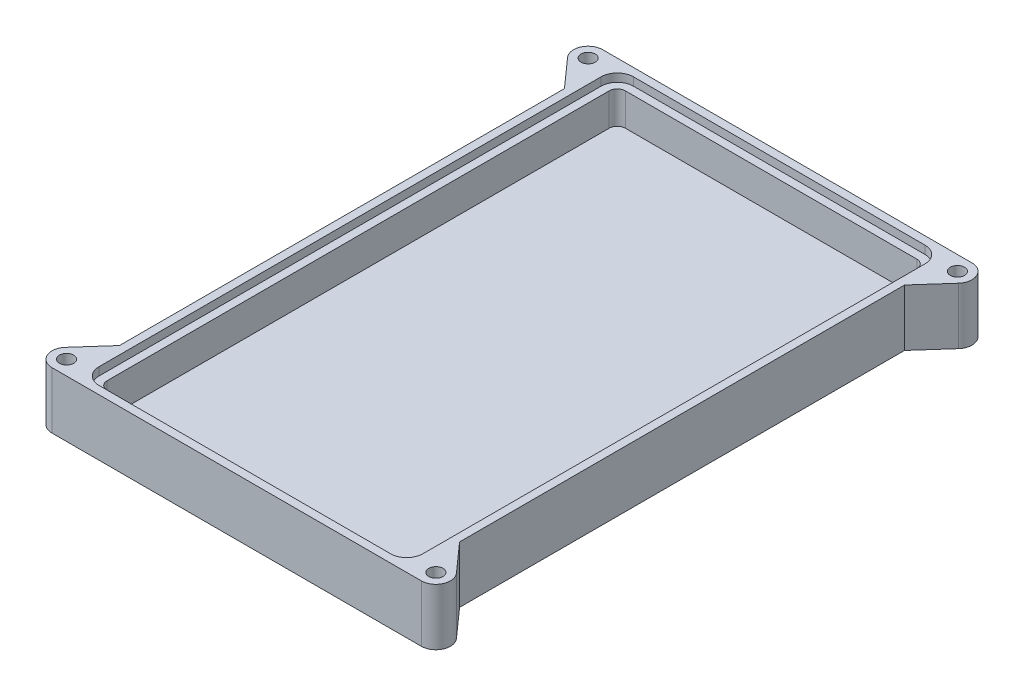
ISO-10303-21;
HEADER;
FILE_DESCRIPTION(('STEP AP214'),'2;1');
FILE_NAME('part.step','',(''),(''),'','','');
FILE_SCHEMA(('AUTOMOTIVE_DESIGN { 1 0 10303 214 1 1 1 1 }'));
ENDSEC;
DATA;
#1=APPLICATION_CONTEXT('core data for automotive mechanical design processes');
#2=APPLICATION_PROTOCOL_DEFINITION('international standard','automotive_design',2000,#1);
#3=PRODUCT_CONTEXT('',#1,'mechanical');
#4=PRODUCT('Part','Part','',(#3));
#5=PRODUCT_RELATED_PRODUCT_CATEGORY('part','',(#4));
#6=PRODUCT_DEFINITION_FORMATION('','',#4);
#7=PRODUCT_DEFINITION_CONTEXT('part definition',#1,'design');
#8=PRODUCT_DEFINITION('design','',#6,#7);
#9=PRODUCT_DEFINITION_SHAPE('','',#8);
#10=(LENGTH_UNIT() NAMED_UNIT(*) SI_UNIT(.MILLI.,.METRE.));
#11=(NAMED_UNIT(*) PLANE_ANGLE_UNIT() SI_UNIT($,.RADIAN.));
#12=(NAMED_UNIT(*) SI_UNIT($,.STERADIAN.) SOLID_ANGLE_UNIT());
#13=UNCERTAINTY_MEASURE_WITH_UNIT(LENGTH_MEASURE(1.E-05),#10,'distance_accuracy_value','');
#14=(GEOMETRIC_REPRESENTATION_CONTEXT(3) GLOBAL_UNCERTAINTY_ASSIGNED_CONTEXT((#13)) GLOBAL_UNIT_ASSIGNED_CONTEXT((#10,
#11,#12)) REPRESENTATION_CONTEXT('',''));
#15=CARTESIAN_POINT('',(0.,0.,0.));
#16=DIRECTION('',(0.,0.,1.));
#17=DIRECTION('',(1.,0.,0.));
#18=AXIS2_PLACEMENT_3D('',#15,#16,#17);
#19=CARTESIAN_POINT('',(45.,21.,-77.5));
#20=DIRECTION('',(0.,1.,0.));
#21=DIRECTION('',(0.,0.,1.));
#22=AXIS2_PLACEMENT_3D('',#19,#20,#21);
#23=CYLINDRICAL_SURFACE('',#22,5.);
#24=CARTESIAN_POINT('',(45.,23.5,-77.5));
#25=DIRECTION('',(0.,1.,0.));
#26=DIRECTION('',(0.,0.,1.));
#27=AXIS2_PLACEMENT_3D('',#24,#25,#26);
#28=CIRCLE('',#27,5.);
#29=CARTESIAN_POINT('',(45.,23.5,-82.5));
#30=VERTEX_POINT('',#29);
#31=CARTESIAN_POINT('',(50.,23.5,-77.5));
#32=VERTEX_POINT('',#31);
#33=EDGE_CURVE('E494',#30,#32,#28,.F.);
#34=ORIENTED_EDGE('',*,*,#33,.F.);
#35=DIRECTION('',(0.,1.,0.));
#36=VECTOR('',#35,1.);
#37=CARTESIAN_POINT('',(45.,21.,-82.5));
#38=LINE('',#37,#36);
#39=CARTESIAN_POINT('',(45.,21.,-82.5));
#40=VERTEX_POINT('',#39);
#41=EDGE_CURVE('E402',#40,#30,#38,.T.);
#42=ORIENTED_EDGE('',*,*,#41,.F.);
#43=CARTESIAN_POINT('',(45.,21.,-77.5));
#44=DIRECTION('',(0.,1.,0.));
#45=DIRECTION('',(0.,0.,1.));
#46=AXIS2_PLACEMENT_3D('',#43,#44,#45);
#47=CIRCLE('',#46,5.);
#48=CARTESIAN_POINT('',(50.,21.,-77.5));
#49=VERTEX_POINT('',#48);
#50=EDGE_CURVE('E378',#49,#40,#47,.T.);
#51=ORIENTED_EDGE('',*,*,#50,.F.);
#52=DIRECTION('',(0.,1.,0.));
#53=VECTOR('',#52,1.);
#54=CARTESIAN_POINT('',(50.,21.,-77.5));
#55=LINE('',#54,#53);
#56=EDGE_CURVE('E403',#49,#32,#55,.T.);
#57=ORIENTED_EDGE('',*,*,#56,.T.);
#58=EDGE_LOOP('',(#34,#42,#51,#57));
#59=FACE_BOUND('',#58,.T.);
#60=ADVANCED_FACE('F34',(#59),#23,.F.);
#61=CARTESIAN_POINT('',(50.,21.,77.5));
#62=DIRECTION('',(1.,0.,0.));
#63=DIRECTION('',(0.,0.,-1.));
#64=AXIS2_PLACEMENT_3D('',#61,#62,#63);
#65=PLANE('',#64);
#66=DIRECTION('',(0.,0.,1.));
#67=VECTOR('',#66,1.);
#68=CARTESIAN_POINT('',(50.,23.5,77.5));
#69=LINE('',#68,#67);
#70=CARTESIAN_POINT('',(50.,23.5,77.5));
#71=VERTEX_POINT('',#70);
#72=EDGE_CURVE('E492',#32,#71,#69,.T.);
#73=ORIENTED_EDGE('',*,*,#72,.F.);
#74=ORIENTED_EDGE('',*,*,#56,.F.);
#75=DIRECTION('',(0.,0.,-1.));
#76=VECTOR('',#75,1.);
#77=CARTESIAN_POINT('',(50.,21.,77.5));
#78=LINE('',#77,#76);
#79=CARTESIAN_POINT('',(50.,21.,77.5));
#80=VERTEX_POINT('',#79);
#81=EDGE_CURVE('E399',#80,#49,#78,.T.);
#82=ORIENTED_EDGE('',*,*,#81,.F.);
#83=DIRECTION('',(0.,1.,0.));
#84=VECTOR('',#83,1.);
#85=CARTESIAN_POINT('',(50.,21.,77.5));
#86=LINE('',#85,#84);
#87=EDGE_CURVE('E406',#80,#71,#86,.T.);
#88=ORIENTED_EDGE('',*,*,#87,.T.);
#89=EDGE_LOOP('',(#73,#74,#82,#88));
#90=FACE_BOUND('',#89,.T.);
#91=ADVANCED_FACE('F515',(#90),#65,.F.);
#92=CARTESIAN_POINT('',(45.,21.,77.5));
#93=DIRECTION('',(0.,1.,0.));
#94=DIRECTION('',(0.,0.,1.));
#95=AXIS2_PLACEMENT_3D('',#92,#93,#94);
#96=CYLINDRICAL_SURFACE('',#95,5.);
#97=CARTESIAN_POINT('',(45.,23.5,77.5));
#98=DIRECTION('',(0.,1.,0.));
#99=DIRECTION('',(0.,0.,1.));
#100=AXIS2_PLACEMENT_3D('',#97,#98,#99);
#101=CIRCLE('',#100,5.);
#102=CARTESIAN_POINT('',(45.,23.5,82.5));
#103=VERTEX_POINT('',#102);
#104=EDGE_CURVE('E490',#71,#103,#101,.F.);
#105=ORIENTED_EDGE('',*,*,#104,.F.);
#106=ORIENTED_EDGE('',*,*,#87,.F.);
#107=CARTESIAN_POINT('',(45.,21.,77.5));
#108=DIRECTION('',(0.,1.,0.));
#109=DIRECTION('',(0.,0.,1.));
#110=AXIS2_PLACEMENT_3D('',#107,#108,#109);
#111=CIRCLE('',#110,5.);
#112=CARTESIAN_POINT('',(45.,21.,82.5));
#113=VERTEX_POINT('',#112);
#114=EDGE_CURVE('E396',#113,#80,#111,.T.);
#115=ORIENTED_EDGE('',*,*,#114,.F.);
#116=DIRECTION('',(0.,1.,0.));
#117=VECTOR('',#116,1.);
#118=CARTESIAN_POINT('',(45.,21.,82.5));
#119=LINE('',#118,#117);
#120=EDGE_CURVE('E409',#113,#103,#119,.T.);
#121=ORIENTED_EDGE('',*,*,#120,.T.);
#122=EDGE_LOOP('',(#105,#106,#115,#121));
#123=FACE_BOUND('',#122,.T.);
#124=ADVANCED_FACE('F521',(#123),#96,.F.);
#125=CARTESIAN_POINT('',(-45.,21.,82.5));
#126=DIRECTION('',(0.,0.,1.));
#127=DIRECTION('',(1.,0.,0.));
#128=AXIS2_PLACEMENT_3D('',#125,#126,#127);
#129=PLANE('',#128);
#130=DIRECTION('',(-1.,0.,0.));
#131=VECTOR('',#130,1.);
#132=CARTESIAN_POINT('',(-45.,23.5,82.5));
#133=LINE('',#132,#131);
#134=CARTESIAN_POINT('',(-45.,23.5,82.5));
#135=VERTEX_POINT('',#134);
#136=EDGE_CURVE('E488',#103,#135,#133,.T.);
#137=ORIENTED_EDGE('',*,*,#136,.F.);
#138=ORIENTED_EDGE('',*,*,#120,.F.);
#139=DIRECTION('',(1.,0.,0.));
#140=VECTOR('',#139,1.);
#141=CARTESIAN_POINT('',(-45.,21.,82.5));
#142=LINE('',#141,#140);
#143=CARTESIAN_POINT('',(-45.,21.,82.5));
#144=VERTEX_POINT('',#143);
#145=EDGE_CURVE('E393',#144,#113,#142,.T.);
#146=ORIENTED_EDGE('',*,*,#145,.F.);
#147=DIRECTION('',(0.,1.,0.));
#148=VECTOR('',#147,1.);
#149=CARTESIAN_POINT('',(-45.,21.,82.5));
#150=LINE('',#149,#148);
#151=EDGE_CURVE('E412',#144,#135,#150,.T.);
#152=ORIENTED_EDGE('',*,*,#151,.T.);
#153=EDGE_LOOP('',(#137,#138,#146,#152));
#154=FACE_BOUND('',#153,.T.);
#155=ADVANCED_FACE('F553',(#154),#129,.F.);
#156=CARTESIAN_POINT('',(-45.,21.,77.5));
#157=DIRECTION('',(0.,1.,0.));
#158=DIRECTION('',(0.,0.,1.));
#159=AXIS2_PLACEMENT_3D('',#156,#157,#158);
#160=CYLINDRICAL_SURFACE('',#159,5.);
#161=CARTESIAN_POINT('',(-45.,23.5,77.5));
#162=DIRECTION('',(0.,1.,0.));
#163=DIRECTION('',(0.,0.,1.));
#164=AXIS2_PLACEMENT_3D('',#161,#162,#163);
#165=CIRCLE('',#164,5.);
#166=CARTESIAN_POINT('',(-50.,23.5,77.5));
#167=VERTEX_POINT('',#166);
#168=EDGE_CURVE('E486',#135,#167,#165,.F.);
#169=ORIENTED_EDGE('',*,*,#168,.F.);
#170=ORIENTED_EDGE('',*,*,#151,.F.);
#171=CARTESIAN_POINT('',(-45.,21.,77.5));
#172=DIRECTION('',(0.,1.,0.));
#173=DIRECTION('',(0.,0.,1.));
#174=AXIS2_PLACEMENT_3D('',#171,#172,#173);
#175=CIRCLE('',#174,5.);
#176=CARTESIAN_POINT('',(-50.,21.,77.5));
#177=VERTEX_POINT('',#176);
#178=EDGE_CURVE('E390',#177,#144,#175,.T.);
#179=ORIENTED_EDGE('',*,*,#178,.F.);
#180=DIRECTION('',(0.,1.,0.));
#181=VECTOR('',#180,1.);
#182=CARTESIAN_POINT('',(-50.,21.,77.5));
#183=LINE('',#182,#181);
#184=EDGE_CURVE('E415',#177,#167,#183,.T.);
#185=ORIENTED_EDGE('',*,*,#184,.T.);
#186=EDGE_LOOP('',(#169,#170,#179,#185));
#187=FACE_BOUND('',#186,.T.);
#188=ADVANCED_FACE('F557',(#187),#160,.F.);
#189=CARTESIAN_POINT('',(-50.,21.,-77.5));
#190=DIRECTION('',(-1.,0.,0.));
#191=DIRECTION('',(0.,0.,1.));
#192=AXIS2_PLACEMENT_3D('',#189,#190,#191);
#193=PLANE('',#192);
#194=DIRECTION('',(0.,0.,-1.));
#195=VECTOR('',#194,1.);
#196=CARTESIAN_POINT('',(-50.,23.5,-77.5));
#197=LINE('',#196,#195);
#198=CARTESIAN_POINT('',(-50.,23.5,-77.5));
#199=VERTEX_POINT('',#198);
#200=EDGE_CURVE('E484',#167,#199,#197,.T.);
#201=ORIENTED_EDGE('',*,*,#200,.F.);
#202=ORIENTED_EDGE('',*,*,#184,.F.);
#203=DIRECTION('',(0.,0.,1.));
#204=VECTOR('',#203,1.);
#205=CARTESIAN_POINT('',(-50.,21.,-77.5));
#206=LINE('',#205,#204);
#207=CARTESIAN_POINT('',(-50.,21.,-77.5));
#208=VERTEX_POINT('',#207);
#209=EDGE_CURVE('E387',#208,#177,#206,.T.);
#210=ORIENTED_EDGE('',*,*,#209,.F.);
#211=DIRECTION('',(0.,1.,0.));
#212=VECTOR('',#211,1.);
#213=CARTESIAN_POINT('',(-50.,21.,-77.5));
#214=LINE('',#213,#212);
#215=EDGE_CURVE('E418',#208,#199,#214,.T.);
#216=ORIENTED_EDGE('',*,*,#215,.T.);
#217=EDGE_LOOP('',(#201,#202,#210,#216));
#218=FACE_BOUND('',#217,.T.);
#219=ADVANCED_FACE('F561',(#218),#193,.F.);
#220=CARTESIAN_POINT('',(-45.,21.,-77.5));
#221=DIRECTION('',(0.,1.,0.));
#222=DIRECTION('',(0.,0.,1.));
#223=AXIS2_PLACEMENT_3D('',#220,#221,#222);
#224=CYLINDRICAL_SURFACE('',#223,5.);
#225=CARTESIAN_POINT('',(-45.,23.5,-77.5));
#226=DIRECTION('',(0.,1.,0.));
#227=DIRECTION('',(0.,0.,1.));
#228=AXIS2_PLACEMENT_3D('',#225,#226,#227);
#229=CIRCLE('',#228,5.);
#230=CARTESIAN_POINT('',(-45.,23.5,-82.5));
#231=VERTEX_POINT('',#230);
#232=EDGE_CURVE('E56',#199,#231,#229,.F.);
#233=ORIENTED_EDGE('',*,*,#232,.F.);
#234=ORIENTED_EDGE('',*,*,#215,.F.);
#235=CARTESIAN_POINT('',(-45.,21.,-77.5));
#236=DIRECTION('',(0.,1.,0.));
#237=DIRECTION('',(0.,0.,1.));
#238=AXIS2_PLACEMENT_3D('',#235,#236,#237);
#239=CIRCLE('',#238,5.);
#240=CARTESIAN_POINT('',(-45.,21.,-82.5));
#241=VERTEX_POINT('',#240);
#242=EDGE_CURVE('E384',#241,#208,#239,.T.);
#243=ORIENTED_EDGE('',*,*,#242,.F.);
#244=DIRECTION('',(0.,1.,0.));
#245=VECTOR('',#244,1.);
#246=CARTESIAN_POINT('',(-45.,21.,-82.5));
#247=LINE('',#246,#245);
#248=EDGE_CURVE('E421',#241,#231,#247,.T.);
#249=ORIENTED_EDGE('',*,*,#248,.T.);
#250=EDGE_LOOP('',(#233,#234,#243,#249));
#251=FACE_BOUND('',#250,.T.);
#252=ADVANCED_FACE('F564',(#251),#224,.F.);
#253=CARTESIAN_POINT('',(45.,21.,-82.5));
#254=DIRECTION('',(0.,0.,-1.));
#255=DIRECTION('',(-1.,0.,0.));
#256=AXIS2_PLACEMENT_3D('',#253,#254,#255);
#257=PLANE('',#256);
#258=DIRECTION('',(1.,0.,0.));
#259=VECTOR('',#258,1.);
#260=CARTESIAN_POINT('',(45.,23.5,-82.5));
#261=LINE('',#260,#259);
#262=EDGE_CURVE('E11',#231,#30,#261,.T.);
#263=ORIENTED_EDGE('',*,*,#262,.F.);
#264=ORIENTED_EDGE('',*,*,#248,.F.);
#265=DIRECTION('',(-1.,0.,0.));
#266=VECTOR('',#265,1.);
#267=CARTESIAN_POINT('',(45.,21.,-82.5));
#268=LINE('',#267,#266);
#269=EDGE_CURVE('E381',#40,#241,#268,.T.);
#270=ORIENTED_EDGE('',*,*,#269,.F.);
#271=ORIENTED_EDGE('',*,*,#41,.T.);
#272=EDGE_LOOP('',(#263,#264,#270,#271));
#273=FACE_BOUND('',#272,.T.);
#274=ADVANCED_FACE('F526',(#273),#257,.F.);
#275=CARTESIAN_POINT('',(45.,21.,-77.5));
#276=DIRECTION('',(0.,1.,0.));
#277=DIRECTION('',(0.,0.,1.));
#278=AXIS2_PLACEMENT_3D('',#275,#276,#277);
#279=PLANE('',#278);
#280=DIRECTION('',(-1.,0.,0.));
#281=VECTOR('',#280,1.);
#282=CARTESIAN_POINT('',(45.,21.,-80.));
#283=LINE('',#282,#281);
#284=CARTESIAN_POINT('',(45.,21.,-80.));
#285=VERTEX_POINT('',#284);
#286=CARTESIAN_POINT('',(-45.,21.,-80.));
#287=VERTEX_POINT('',#286);
#288=EDGE_CURVE('E375',#285,#287,#283,.T.);
#289=ORIENTED_EDGE('',*,*,#288,.F.);
#290=CARTESIAN_POINT('',(45.,21.,-77.5));
#291=DIRECTION('',(0.,1.,0.));
#292=DIRECTION('',(0.,0.,1.));
#293=AXIS2_PLACEMENT_3D('',#290,#291,#292);
#294=CIRCLE('',#293,2.5);
#295=CARTESIAN_POINT('',(47.5,21.,-77.5));
#296=VERTEX_POINT('',#295);
#297=EDGE_CURVE('E372',#296,#285,#294,.T.);
#298=ORIENTED_EDGE('',*,*,#297,.F.);
#299=DIRECTION('',(0.,0.,-1.));
#300=VECTOR('',#299,1.);
#301=CARTESIAN_POINT('',(47.5,21.,77.5));
#302=LINE('',#301,#300);
#303=CARTESIAN_POINT('',(47.5,21.,77.5));
#304=VERTEX_POINT('',#303);
#305=EDGE_CURVE('E369',#304,#296,#302,.T.);
#306=ORIENTED_EDGE('',*,*,#305,.F.);
#307=CARTESIAN_POINT('',(45.,21.,77.5));
#308=DIRECTION('',(0.,1.,0.));
#309=DIRECTION('',(0.,0.,1.));
#310=AXIS2_PLACEMENT_3D('',#307,#308,#309);
#311=CIRCLE('',#310,2.5);
#312=CARTESIAN_POINT('',(45.,21.,80.));
#313=VERTEX_POINT('',#312);
#314=EDGE_CURVE('E366',#313,#304,#311,.T.);
#315=ORIENTED_EDGE('',*,*,#314,.F.);
#316=DIRECTION('',(1.,0.,0.));
#317=VECTOR('',#316,1.);
#318=CARTESIAN_POINT('',(-45.,21.,80.));
#319=LINE('',#318,#317);
#320=CARTESIAN_POINT('',(-45.,21.,80.));
#321=VERTEX_POINT('',#320);
#322=EDGE_CURVE('E363',#321,#313,#319,.T.);
#323=ORIENTED_EDGE('',*,*,#322,.F.);
#324=CARTESIAN_POINT('',(-45.,21.,77.5));
#325=DIRECTION('',(0.,1.,0.));
#326=DIRECTION('',(0.,0.,1.));
#327=AXIS2_PLACEMENT_3D('',#324,#325,#326);
#328=CIRCLE('',#327,2.49999999999999);
#329=CARTESIAN_POINT('',(-47.5,21.,77.5));
#330=VERTEX_POINT('',#329);
#331=EDGE_CURVE('E360',#330,#321,#328,.T.);
#332=ORIENTED_EDGE('',*,*,#331,.F.);
#333=DIRECTION('',(0.,0.,1.));
#334=VECTOR('',#333,1.);
#335=CARTESIAN_POINT('',(-47.5,21.,-77.5));
#336=LINE('',#335,#334);
#337=CARTESIAN_POINT('',(-47.5,21.,-77.5));
#338=VERTEX_POINT('',#337);
#339=EDGE_CURVE('E351',#338,#330,#336,.T.);
#340=ORIENTED_EDGE('',*,*,#339,.F.);
#341=CARTESIAN_POINT('',(-45.,21.,-77.5));
#342=DIRECTION('',(0.,1.,0.));
#343=DIRECTION('',(0.,0.,1.));
#344=AXIS2_PLACEMENT_3D('',#341,#342,#343);
#345=CIRCLE('',#344,2.5);
#346=EDGE_CURVE('E347',#287,#338,#345,.T.);
#347=ORIENTED_EDGE('',*,*,#346,.F.);
#348=EDGE_LOOP('',(#289,#298,#306,#315,#323,#332,#340,#347));
#349=FACE_BOUND('',#348,.T.);
#350=ORIENTED_EDGE('',*,*,#50,.T.);
#351=ORIENTED_EDGE('',*,*,#269,.T.);
#352=ORIENTED_EDGE('',*,*,#242,.T.);
#353=ORIENTED_EDGE('',*,*,#209,.T.);
#354=ORIENTED_EDGE('',*,*,#178,.T.);
#355=ORIENTED_EDGE('',*,*,#145,.T.);
#356=ORIENTED_EDGE('',*,*,#114,.T.);
#357=ORIENTED_EDGE('',*,*,#81,.T.);
#358=EDGE_LOOP('',(#350,#351,#352,#353,#354,#355,#356,#357));
#359=FACE_BOUND('',#358,.T.);
#360=ADVANCED_FACE('F546',(#349,#359),#279,.T.);
#361=CARTESIAN_POINT('',(0.,11.,0.));
#362=DIRECTION('',(0.,1.,0.));
#363=DIRECTION('',(0.,0.,1.));
#364=AXIS2_PLACEMENT_3D('',#361,#362,#363);
#365=PLANE('',#364);
#366=CARTESIAN_POINT('',(-45.,11.,-77.5));
#367=DIRECTION('',(0.,1.,0.));
#368=DIRECTION('',(0.,0.,1.));
#369=AXIS2_PLACEMENT_3D('',#366,#367,#368);
#370=CIRCLE('',#369,2.5);
#371=CARTESIAN_POINT('',(-45.,11.,-80.));
#372=VERTEX_POINT('',#371);
#373=CARTESIAN_POINT('',(-47.5,11.,-77.5));
#374=VERTEX_POINT('',#373);
#375=EDGE_CURVE('E263',#372,#374,#370,.T.);
#376=ORIENTED_EDGE('',*,*,#375,.T.);
#377=DIRECTION('',(0.,0.,1.));
#378=VECTOR('',#377,1.);
#379=CARTESIAN_POINT('',(-47.5,11.,0.));
#380=LINE('',#379,#378);
#381=CARTESIAN_POINT('',(-47.5,11.,77.5));
#382=VERTEX_POINT('',#381);
#383=EDGE_CURVE('E284',#374,#382,#380,.T.);
#384=ORIENTED_EDGE('',*,*,#383,.T.);
#385=CARTESIAN_POINT('',(-45.,11.,77.5));
#386=DIRECTION('',(0.,1.,0.));
#387=DIRECTION('',(0.,0.,1.));
#388=AXIS2_PLACEMENT_3D('',#385,#386,#387);
#389=CIRCLE('',#388,2.49999999999999);
#390=CARTESIAN_POINT('',(-45.,11.,80.));
#391=VERTEX_POINT('',#390);
#392=EDGE_CURVE('E281',#382,#391,#389,.T.);
#393=ORIENTED_EDGE('',*,*,#392,.T.);
#394=DIRECTION('',(1.,0.,0.));
#395=VECTOR('',#394,1.);
#396=CARTESIAN_POINT('',(0.,11.,80.));
#397=LINE('',#396,#395);
#398=CARTESIAN_POINT('',(45.,11.,80.));
#399=VERTEX_POINT('',#398);
#400=EDGE_CURVE('E278',#391,#399,#397,.T.);
#401=ORIENTED_EDGE('',*,*,#400,.T.);
#402=CARTESIAN_POINT('',(45.,11.,77.5));
#403=DIRECTION('',(0.,1.,0.));
#404=DIRECTION('',(0.,0.,1.));
#405=AXIS2_PLACEMENT_3D('',#402,#403,#404);
#406=CIRCLE('',#405,2.5);
#407=CARTESIAN_POINT('',(47.5,11.,77.5));
#408=VERTEX_POINT('',#407);
#409=EDGE_CURVE('E275',#399,#408,#406,.T.);
#410=ORIENTED_EDGE('',*,*,#409,.T.);
#411=DIRECTION('',(0.,0.,-1.));
#412=VECTOR('',#411,1.);
#413=CARTESIAN_POINT('',(47.5,11.,0.));
#414=LINE('',#413,#412);
#415=CARTESIAN_POINT('',(47.5,11.,-77.5));
#416=VERTEX_POINT('',#415);
#417=EDGE_CURVE('E272',#408,#416,#414,.T.);
#418=ORIENTED_EDGE('',*,*,#417,.T.);
#419=CARTESIAN_POINT('',(45.,11.,-77.5));
#420=DIRECTION('',(0.,1.,0.));
#421=DIRECTION('',(0.,0.,1.));
#422=AXIS2_PLACEMENT_3D('',#419,#420,#421);
#423=CIRCLE('',#422,2.5);
#424=CARTESIAN_POINT('',(45.,11.,-80.));
#425=VERTEX_POINT('',#424);
#426=EDGE_CURVE('E269',#416,#425,#423,.T.);
#427=ORIENTED_EDGE('',*,*,#426,.T.);
#428=DIRECTION('',(-1.,0.,0.));
#429=VECTOR('',#428,1.);
#430=CARTESIAN_POINT('',(0.,11.,-80.));
#431=LINE('',#430,#429);
#432=EDGE_CURVE('E266',#425,#372,#431,.T.);
#433=ORIENTED_EDGE('',*,*,#432,.T.);
#434=EDGE_LOOP('',(#376,#384,#393,#401,#410,#418,#427,#433));
#435=FACE_BOUND('',#434,.T.);
#436=ADVANCED_FACE('F548',(#435),#365,.T.);
#437=CARTESIAN_POINT('',(-47.5,36.5,0.));
#438=DIRECTION('',(1.,0.,0.));
#439=DIRECTION('',(0.,0.,-1.));
#440=AXIS2_PLACEMENT_3D('',#437,#438,#439);
#441=PLANE('',#440);
#442=DIRECTION('',(0.,-1.,0.));
#443=VECTOR('',#442,1.);
#444=CARTESIAN_POINT('',(-47.5,36.5,-77.5));
#445=LINE('',#444,#443);
#446=EDGE_CURVE('E287',#338,#374,#445,.T.);
#447=ORIENTED_EDGE('',*,*,#446,.F.);
#448=ORIENTED_EDGE('',*,*,#339,.T.);
#449=DIRECTION('',(0.,-1.,0.));
#450=VECTOR('',#449,1.);
#451=CARTESIAN_POINT('',(-47.5,36.5,77.5));
#452=LINE('',#451,#450);
#453=EDGE_CURVE('E289',#330,#382,#452,.T.);
#454=ORIENTED_EDGE('',*,*,#453,.T.);
#455=ORIENTED_EDGE('',*,*,#383,.F.);
#456=EDGE_LOOP('',(#447,#448,#454,#455));
#457=FACE_BOUND('',#456,.T.);
#458=ADVANCED_FACE('F600',(#457),#441,.T.);
#459=CARTESIAN_POINT('',(-45.,36.5,-77.5));
#460=DIRECTION('',(0.,-1.,0.));
#461=DIRECTION('',(0.,0.,-1.));
#462=AXIS2_PLACEMENT_3D('',#459,#460,#461);
#463=CYLINDRICAL_SURFACE('',#462,2.5);
#464=DIRECTION('',(0.,-1.,0.));
#465=VECTOR('',#464,1.);
#466=CARTESIAN_POINT('',(-45.,36.5,-80.));
#467=LINE('',#466,#465);
#468=EDGE_CURVE('E42',#287,#372,#467,.T.);
#469=ORIENTED_EDGE('',*,*,#468,.F.);
#470=ORIENTED_EDGE('',*,*,#346,.T.);
#471=ORIENTED_EDGE('',*,*,#446,.T.);
#472=ORIENTED_EDGE('',*,*,#375,.F.);
#473=EDGE_LOOP('',(#469,#470,#471,#472));
#474=FACE_BOUND('',#473,.T.);
#475=ADVANCED_FACE('F607',(#474),#463,.F.);
#476=CARTESIAN_POINT('',(0.,36.5,-80.));
#477=DIRECTION('',(0.,0.,1.));
#478=DIRECTION('',(1.,0.,0.));
#479=AXIS2_PLACEMENT_3D('',#476,#477,#478);
#480=PLANE('',#479);
#481=DIRECTION('',(0.,-1.,0.));
#482=VECTOR('',#481,1.);
#483=CARTESIAN_POINT('',(45.,36.5,-80.));
#484=LINE('',#483,#482);
#485=EDGE_CURVE('E299',#285,#425,#484,.T.);
#486=ORIENTED_EDGE('',*,*,#485,.F.);
#487=ORIENTED_EDGE('',*,*,#288,.T.);
#488=ORIENTED_EDGE('',*,*,#468,.T.);
#489=ORIENTED_EDGE('',*,*,#432,.F.);
#490=EDGE_LOOP('',(#486,#487,#488,#489));
#491=FACE_BOUND('',#490,.T.);
#492=ADVANCED_FACE('F615',(#491),#480,.T.);
#493=CARTESIAN_POINT('',(45.,36.5,-77.5));
#494=DIRECTION('',(0.,-1.,0.));
#495=DIRECTION('',(0.,0.,-1.));
#496=AXIS2_PLACEMENT_3D('',#493,#494,#495);
#497=CYLINDRICAL_SURFACE('',#496,2.5);
#498=DIRECTION('',(0.,-1.,0.));
#499=VECTOR('',#498,1.);
#500=CARTESIAN_POINT('',(47.5,36.5,-77.5));
#501=LINE('',#500,#499);
#502=EDGE_CURVE('E297',#296,#416,#501,.T.);
#503=ORIENTED_EDGE('',*,*,#502,.F.);
#504=ORIENTED_EDGE('',*,*,#297,.T.);
#505=ORIENTED_EDGE('',*,*,#485,.T.);
#506=ORIENTED_EDGE('',*,*,#426,.F.);
#507=EDGE_LOOP('',(#503,#504,#505,#506));
#508=FACE_BOUND('',#507,.T.);
#509=ADVANCED_FACE('F623',(#508),#497,.F.);
#510=CARTESIAN_POINT('',(47.5,36.5,0.));
#511=DIRECTION('',(-1.,0.,0.));
#512=DIRECTION('',(0.,0.,1.));
#513=AXIS2_PLACEMENT_3D('',#510,#511,#512);
#514=PLANE('',#513);
#515=DIRECTION('',(0.,-1.,0.));
#516=VECTOR('',#515,1.);
#517=CARTESIAN_POINT('',(47.5,36.5,77.5));
#518=LINE('',#517,#516);
#519=EDGE_CURVE('E295',#304,#408,#518,.T.);
#520=ORIENTED_EDGE('',*,*,#519,.F.);
#521=ORIENTED_EDGE('',*,*,#305,.T.);
#522=ORIENTED_EDGE('',*,*,#502,.T.);
#523=ORIENTED_EDGE('',*,*,#417,.F.);
#524=EDGE_LOOP('',(#520,#521,#522,#523));
#525=FACE_BOUND('',#524,.T.);
#526=ADVANCED_FACE('F631',(#525),#514,.T.);
#527=CARTESIAN_POINT('',(45.,36.5,77.5));
#528=DIRECTION('',(0.,-1.,0.));
#529=DIRECTION('',(0.,0.,-1.));
#530=AXIS2_PLACEMENT_3D('',#527,#528,#529);
#531=CYLINDRICAL_SURFACE('',#530,2.5);
#532=DIRECTION('',(0.,-1.,0.));
#533=VECTOR('',#532,1.);
#534=CARTESIAN_POINT('',(45.,36.5,80.));
#535=LINE('',#534,#533);
#536=EDGE_CURVE('E293',#313,#399,#535,.T.);
#537=ORIENTED_EDGE('',*,*,#536,.F.);
#538=ORIENTED_EDGE('',*,*,#314,.T.);
#539=ORIENTED_EDGE('',*,*,#519,.T.);
#540=ORIENTED_EDGE('',*,*,#409,.F.);
#541=EDGE_LOOP('',(#537,#538,#539,#540));
#542=FACE_BOUND('',#541,.T.);
#543=ADVANCED_FACE('F639',(#542),#531,.F.);
#544=CARTESIAN_POINT('',(0.,36.5,80.));
#545=DIRECTION('',(0.,0.,-1.));
#546=DIRECTION('',(-1.,0.,0.));
#547=AXIS2_PLACEMENT_3D('',#544,#545,#546);
#548=PLANE('',#547);
#549=DIRECTION('',(0.,-1.,0.));
#550=VECTOR('',#549,1.);
#551=CARTESIAN_POINT('',(-45.,36.5,80.));
#552=LINE('',#551,#550);
#553=EDGE_CURVE('E291',#321,#391,#552,.T.);
#554=ORIENTED_EDGE('',*,*,#553,.F.);
#555=ORIENTED_EDGE('',*,*,#322,.T.);
#556=ORIENTED_EDGE('',*,*,#536,.T.);
#557=ORIENTED_EDGE('',*,*,#400,.F.);
#558=EDGE_LOOP('',(#554,#555,#556,#557));
#559=FACE_BOUND('',#558,.T.);
#560=ADVANCED_FACE('F541',(#559),#548,.T.);
#561=CARTESIAN_POINT('',(-45.,36.5,77.5));
#562=DIRECTION('',(0.,-1.,0.));
#563=DIRECTION('',(0.,0.,-1.));
#564=AXIS2_PLACEMENT_3D('',#561,#562,#563);
#565=CYLINDRICAL_SURFACE('',#564,2.49999999999999);
#566=ORIENTED_EDGE('',*,*,#453,.F.);
#567=ORIENTED_EDGE('',*,*,#331,.T.);
#568=ORIENTED_EDGE('',*,*,#553,.T.);
#569=ORIENTED_EDGE('',*,*,#392,.F.);
#570=EDGE_LOOP('',(#566,#567,#568,#569));
#571=FACE_BOUND('',#570,.T.);
#572=ADVANCED_FACE('F535',(#571),#565,.F.);
#573=CARTESIAN_POINT('',(57.,23.5,-80.5));
#574=DIRECTION('',(0.,1.,0.));
#575=DIRECTION('',(0.,0.,1.));
#576=AXIS2_PLACEMENT_3D('',#573,#574,#575);
#577=PLANE('',#576);
#578=CARTESIAN_POINT('',(-57.,23.5,-80.5));
#579=DIRECTION('',(0.,1.,0.));
#580=DIRECTION('',(0.,0.,1.));
#581=AXIS2_PLACEMENT_3D('',#578,#579,#580);
#582=CIRCLE('',#581,2.2);
#583=CARTESIAN_POINT('',(-57.,23.5,-78.3));
#584=VERTEX_POINT('',#583);
#585=EDGE_CURVE('E348',#584,#584,#582,.T.);
#586=ORIENTED_EDGE('',*,*,#585,.F.);
#587=EDGE_LOOP('',(#586));
#588=FACE_BOUND('',#587,.T.);
#589=CARTESIAN_POINT('',(57.,23.5,80.5));
#590=DIRECTION('',(0.,1.,0.));
#591=DIRECTION('',(0.,0.,1.));
#592=AXIS2_PLACEMENT_3D('',#589,#590,#591);
#593=CIRCLE('',#592,2.2);
#594=CARTESIAN_POINT('',(57.,23.5,82.7));
#595=VERTEX_POINT('',#594);
#596=EDGE_CURVE('E496',#595,#595,#593,.T.);
#597=ORIENTED_EDGE('',*,*,#596,.F.);
#598=EDGE_LOOP('',(#597));
#599=FACE_BOUND('',#598,.T.);
#600=CARTESIAN_POINT('',(57.,23.5,-80.5));
#601=DIRECTION('',(0.,1.,0.));
#602=DIRECTION('',(0.,0.,1.));
#603=AXIS2_PLACEMENT_3D('',#600,#601,#602);
#604=CIRCLE('',#603,4.5);
#605=CARTESIAN_POINT('',(60.3595109470347,23.5,-77.5060584179457));
#606=VERTEX_POINT('',#605);
#607=CARTESIAN_POINT('',(57.,23.5,-85.));
#608=VERTEX_POINT('',#607);
#609=EDGE_CURVE('E215',#606,#608,#604,.T.);
#610=ORIENTED_EDGE('',*,*,#609,.T.);
#611=DIRECTION('',(-1.,0.,0.));
#612=VECTOR('',#611,1.);
#613=CARTESIAN_POINT('',(57.,23.5,-85.));
#614=LINE('',#613,#612);
#615=CARTESIAN_POINT('',(-57.,23.5,-85.));
#616=VERTEX_POINT('',#615);
#617=EDGE_CURVE('E218',#608,#616,#614,.T.);
#618=ORIENTED_EDGE('',*,*,#617,.T.);
#619=CARTESIAN_POINT('',(-57.,23.5,-80.5));
#620=DIRECTION('',(0.,1.,0.));
#621=DIRECTION('',(0.,0.,1.));
#622=AXIS2_PLACEMENT_3D('',#619,#620,#621);
#623=CIRCLE('',#622,4.5);
#624=CARTESIAN_POINT('',(-60.3595109470347,23.5,-77.5060584179457));
#625=VERTEX_POINT('',#624);
#626=EDGE_CURVE('E230',#616,#625,#623,.T.);
#627=ORIENTED_EDGE('',*,*,#626,.T.);
#628=DIRECTION('',(0.665320351567619,0.,0.746557988229943));
#629=VECTOR('',#628,1.);
#630=CARTESIAN_POINT('',(-60.3595109470347,23.5,-77.5060584179457));
#631=LINE('',#630,#629);
#632=CARTESIAN_POINT('',(-52.5,23.5,-68.6868773012636));
#633=VERTEX_POINT('',#632);
#634=EDGE_CURVE('E462',#625,#633,#631,.T.);
#635=ORIENTED_EDGE('',*,*,#634,.T.);
#636=DIRECTION('',(0.,0.,1.));
#637=VECTOR('',#636,1.);
#638=CARTESIAN_POINT('',(-52.5,23.5,-68.6868773012636));
#639=LINE('',#638,#637);
#640=CARTESIAN_POINT('',(-52.5,23.5,68.6868773012636));
#641=VERTEX_POINT('',#640);
#642=EDGE_CURVE('E458',#633,#641,#639,.T.);
#643=ORIENTED_EDGE('',*,*,#642,.T.);
#644=DIRECTION('',(-0.665320351567618,0.,0.746557988229944));
#645=VECTOR('',#644,1.);
#646=CARTESIAN_POINT('',(-52.5,23.5,68.6868773012636));
#647=LINE('',#646,#645);
#648=CARTESIAN_POINT('',(-60.3595109470347,23.5,77.5060584179457));
#649=VERTEX_POINT('',#648);
#650=EDGE_CURVE('E470',#641,#649,#647,.T.);
#651=ORIENTED_EDGE('',*,*,#650,.T.);
#652=CARTESIAN_POINT('',(-57.,23.5,80.5));
#653=DIRECTION('',(0.,1.,0.));
#654=DIRECTION('',(0.,0.,1.));
#655=AXIS2_PLACEMENT_3D('',#652,#653,#654);
#656=CIRCLE('',#655,4.49999999999999);
#657=CARTESIAN_POINT('',(-57.,23.5,85.));
#658=VERTEX_POINT('',#657);
#659=EDGE_CURVE('E472',#649,#658,#656,.T.);
#660=ORIENTED_EDGE('',*,*,#659,.T.);
#661=DIRECTION('',(1.,0.,0.));
#662=VECTOR('',#661,1.);
#663=CARTESIAN_POINT('',(-57.,23.5,85.));
#664=LINE('',#663,#662);
#665=CARTESIAN_POINT('',(57.,23.5,85.));
#666=VERTEX_POINT('',#665);
#667=EDGE_CURVE('E474',#658,#666,#664,.T.);
#668=ORIENTED_EDGE('',*,*,#667,.T.);
#669=CARTESIAN_POINT('',(57.,23.5,80.5));
#670=DIRECTION('',(0.,1.,0.));
#671=DIRECTION('',(0.,0.,1.));
#672=AXIS2_PLACEMENT_3D('',#669,#670,#671);
#673=CIRCLE('',#672,4.5);
#674=CARTESIAN_POINT('',(60.3595109470347,23.5,77.5060584179457));
#675=VERTEX_POINT('',#674);
#676=EDGE_CURVE('E476',#666,#675,#673,.T.);
#677=ORIENTED_EDGE('',*,*,#676,.T.);
#678=DIRECTION('',(-0.665320351567619,0.,-0.746557988229943));
#679=VECTOR('',#678,1.);
#680=CARTESIAN_POINT('',(60.3595109470347,23.5,77.5060584179457));
#681=LINE('',#680,#679);
#682=CARTESIAN_POINT('',(52.5,23.5,68.6868773012636));
#683=VERTEX_POINT('',#682);
#684=EDGE_CURVE('E478',#675,#683,#681,.T.);
#685=ORIENTED_EDGE('',*,*,#684,.T.);
#686=DIRECTION('',(0.,0.,-1.));
#687=VECTOR('',#686,1.);
#688=CARTESIAN_POINT('',(52.5,23.5,68.6868773012636));
#689=LINE('',#688,#687);
#690=CARTESIAN_POINT('',(52.5,23.5,-68.6868773012636));
#691=VERTEX_POINT('',#690);
#692=EDGE_CURVE('E480',#683,#691,#689,.T.);
#693=ORIENTED_EDGE('',*,*,#692,.T.);
#694=DIRECTION('',(0.665320351567618,0.,-0.746557988229944));
#695=VECTOR('',#694,1.);
#696=CARTESIAN_POINT('',(52.5,23.5,-68.6868773012636));
#697=LINE('',#696,#695);
#698=EDGE_CURVE('E49',#691,#606,#697,.T.);
#699=ORIENTED_EDGE('',*,*,#698,.T.);
#700=EDGE_LOOP('',(#610,#618,#627,#635,#643,#651,#660,#668,#677,#685,#693,#699));
#701=FACE_BOUND('',#700,.T.);
#702=ORIENTED_EDGE('',*,*,#33,.T.);
#703=ORIENTED_EDGE('',*,*,#72,.T.);
#704=ORIENTED_EDGE('',*,*,#104,.T.);
#705=ORIENTED_EDGE('',*,*,#136,.T.);
#706=ORIENTED_EDGE('',*,*,#168,.T.);
#707=ORIENTED_EDGE('',*,*,#200,.T.);
#708=ORIENTED_EDGE('',*,*,#232,.T.);
#709=ORIENTED_EDGE('',*,*,#262,.T.);
#710=EDGE_LOOP('',(#702,#703,#704,#705,#706,#707,#708,#709));
#711=FACE_BOUND('',#710,.T.);
#712=CARTESIAN_POINT('',(-57.,23.5,80.5));
#713=DIRECTION('',(0.,1.,0.));
#714=DIRECTION('',(0.,0.,1.));
#715=AXIS2_PLACEMENT_3D('',#712,#713,#714);
#716=CIRCLE('',#715,2.2);
#717=CARTESIAN_POINT('',(-57.,23.5,82.7));
#718=VERTEX_POINT('',#717);
#719=EDGE_CURVE('E354',#718,#718,#716,.F.);
#720=ORIENTED_EDGE('',*,*,#719,.T.);
#721=EDGE_LOOP('',(#720));
#722=FACE_BOUND('',#721,.T.);
#723=CARTESIAN_POINT('',(57.,23.5,-80.5));
#724=DIRECTION('',(0.,1.,0.));
#725=DIRECTION('',(0.,0.,1.));
#726=AXIS2_PLACEMENT_3D('',#723,#724,#725);
#727=CIRCLE('',#726,2.2);
#728=CARTESIAN_POINT('',(57.,23.5,-78.3));
#729=VERTEX_POINT('',#728);
#730=EDGE_CURVE('E345',#729,#729,#727,.F.);
#731=ORIENTED_EDGE('',*,*,#730,.T.);
#732=EDGE_LOOP('',(#731));
#733=FACE_BOUND('',#732,.T.);
#734=ADVANCED_FACE('F217',(#588,#599,#701,#711,#722,#733),#577,.T.);
#735=CARTESIAN_POINT('',(57.,0.,-80.5));
#736=DIRECTION('',(0.,1.,0.));
#737=DIRECTION('',(0.,0.,1.));
#738=AXIS2_PLACEMENT_3D('',#735,#736,#737);
#739=CYLINDRICAL_SURFACE('',#738,2.2);
#740=CARTESIAN_POINT('',(57.,6.,-80.5));
#741=DIRECTION('',(0.,-1.,0.));
#742=DIRECTION('',(0.,0.,-1.));
#743=AXIS2_PLACEMENT_3D('',#740,#741,#742);
#744=CIRCLE('',#743,2.2);
#745=CARTESIAN_POINT('',(57.,6.,-82.7));
#746=VERTEX_POINT('',#745);
#747=EDGE_CURVE('E237',#746,#746,#744,.F.);
#748=ORIENTED_EDGE('',*,*,#747,.F.);
#749=EDGE_LOOP('',(#748));
#750=FACE_BOUND('',#749,.T.);
#751=ORIENTED_EDGE('',*,*,#730,.F.);
#752=EDGE_LOOP('',(#751));
#753=FACE_BOUND('',#752,.T.);
#754=ADVANCED_FACE('F338',(#750,#753),#739,.F.);
#755=CARTESIAN_POINT('',(-57.,0.,80.5));
#756=DIRECTION('',(0.,1.,0.));
#757=DIRECTION('',(0.,0.,1.));
#758=AXIS2_PLACEMENT_3D('',#755,#756,#757);
#759=CYLINDRICAL_SURFACE('',#758,2.2);
#760=CARTESIAN_POINT('',(-57.,6.,80.5));
#761=DIRECTION('',(0.,-1.,0.));
#762=DIRECTION('',(0.,0.,-1.));
#763=AXIS2_PLACEMENT_3D('',#760,#761,#762);
#764=CIRCLE('',#763,2.2);
#765=CARTESIAN_POINT('',(-57.,6.,78.3));
#766=VERTEX_POINT('',#765);
#767=EDGE_CURVE('E303',#766,#766,#764,.F.);
#768=ORIENTED_EDGE('',*,*,#767,.F.);
#769=EDGE_LOOP('',(#768));
#770=FACE_BOUND('',#769,.T.);
#771=ORIENTED_EDGE('',*,*,#719,.F.);
#772=EDGE_LOOP('',(#771));
#773=FACE_BOUND('',#772,.T.);
#774=ADVANCED_FACE('F341',(#770,#773),#759,.F.);
#775=CARTESIAN_POINT('',(-4.85597372211685,62.4580979606499,4.32756489775421));
#776=DIRECTION('',(0.746557988229943,0.,-0.665320351567619));
#777=DIRECTION('',(-0.665320351567619,0.,-0.746557988229943));
#778=AXIS2_PLACEMENT_3D('',#775,#776,#777);
#779=PLANE('',#778);
#780=DIRECTION('',(0.,-1.,0.));
#781=VECTOR('',#780,1.);
#782=CARTESIAN_POINT('',(52.5,62.4580979606499,68.6868773012636));
#783=LINE('',#782,#781);
#784=CARTESIAN_POINT('',(52.5,6.,68.6868773012636));
#785=VERTEX_POINT('',#784);
#786=EDGE_CURVE('E261',#683,#785,#783,.T.);
#787=ORIENTED_EDGE('',*,*,#786,.F.);
#788=ORIENTED_EDGE('',*,*,#684,.F.);
#789=DIRECTION('',(0.,-1.,0.));
#790=VECTOR('',#789,1.);
#791=CARTESIAN_POINT('',(60.3595109470347,62.4580979606499,77.5060584179457));
#792=LINE('',#791,#790);
#793=CARTESIAN_POINT('',(60.3595109470347,6.,77.5060584179457));
#794=VERTEX_POINT('',#793);
#795=EDGE_CURVE('E259',#675,#794,#792,.T.);
#796=ORIENTED_EDGE('',*,*,#795,.T.);
#797=DIRECTION('',(0.665320351567618,0.,0.746557988229944));
#798=VECTOR('',#797,1.);
#799=CARTESIAN_POINT('',(52.5,6.,68.6868773012636));
#800=LINE('',#799,#798);
#801=EDGE_CURVE('E436',#785,#794,#800,.T.);
#802=ORIENTED_EDGE('',*,*,#801,.F.);
#803=EDGE_LOOP('',(#787,#788,#796,#802));
#804=FACE_BOUND('',#803,.T.);
#805=ADVANCED_FACE('F503',(#804),#779,.T.);
#806=CARTESIAN_POINT('',(57.,62.4580979606499,80.5));
#807=DIRECTION('',(0.,-1.,0.));
#808=DIRECTION('',(0.,0.,-1.));
#809=AXIS2_PLACEMENT_3D('',#806,#807,#808);
#810=CYLINDRICAL_SURFACE('',#809,4.50000000000001);
#811=ORIENTED_EDGE('',*,*,#795,.F.);
#812=ORIENTED_EDGE('',*,*,#676,.F.);
#813=DIRECTION('',(0.,-1.,0.));
#814=VECTOR('',#813,1.);
#815=CARTESIAN_POINT('',(57.,62.4580979606499,85.));
#816=LINE('',#815,#814);
#817=CARTESIAN_POINT('',(57.,6.,85.));
#818=VERTEX_POINT('',#817);
#819=EDGE_CURVE('E256',#666,#818,#816,.T.);
#820=ORIENTED_EDGE('',*,*,#819,.T.);
#821=CARTESIAN_POINT('',(57.,6.,80.5));
#822=DIRECTION('',(0.,-1.,0.));
#823=DIRECTION('',(0.,0.,-1.));
#824=AXIS2_PLACEMENT_3D('',#821,#822,#823);
#825=CIRCLE('',#824,4.49999999999999);
#826=EDGE_CURVE('E439',#794,#818,#825,.T.);
#827=ORIENTED_EDGE('',*,*,#826,.F.);
#828=EDGE_LOOP('',(#811,#812,#820,#827));
#829=FACE_BOUND('',#828,.T.);
#830=ADVANCED_FACE('F509',(#829),#810,.T.);
#831=CARTESIAN_POINT('',(-57.,62.4580979606499,80.5));
#832=DIRECTION('',(0.,-1.,0.));
#833=DIRECTION('',(0.,0.,-1.));
#834=AXIS2_PLACEMENT_3D('',#831,#832,#833);
#835=CYLINDRICAL_SURFACE('',#834,4.50000000000001);
#836=ORIENTED_EDGE('',*,*,#659,.F.);
#837=DIRECTION('',(0.,-1.,0.));
#838=VECTOR('',#837,1.);
#839=CARTESIAN_POINT('',(-60.3595109470347,62.4580979606499,77.5060584179457));
#840=LINE('',#839,#838);
#841=CARTESIAN_POINT('',(-60.3595109470347,6.,77.5060584179457));
#842=VERTEX_POINT('',#841);
#843=EDGE_CURVE('E254',#649,#842,#840,.T.);
#844=ORIENTED_EDGE('',*,*,#843,.T.);
#845=CARTESIAN_POINT('',(-57.,6.,80.5));
#846=DIRECTION('',(0.,-1.,0.));
#847=DIRECTION('',(0.,0.,-1.));
#848=AXIS2_PLACEMENT_3D('',#845,#846,#847);
#849=CIRCLE('',#848,4.5);
#850=CARTESIAN_POINT('',(-57.,6.,85.));
#851=VERTEX_POINT('',#850);
#852=EDGE_CURVE('E445',#851,#842,#849,.T.);
#853=ORIENTED_EDGE('',*,*,#852,.F.);
#854=DIRECTION('',(0.,-1.,0.));
#855=VECTOR('',#854,1.);
#856=CARTESIAN_POINT('',(-57.,62.4580979606499,85.));
#857=LINE('',#856,#855);
#858=EDGE_CURVE('E251',#658,#851,#857,.T.);
#859=ORIENTED_EDGE('',*,*,#858,.F.);
#860=EDGE_LOOP('',(#836,#844,#853,#859));
#861=FACE_BOUND('',#860,.T.);
#862=ADVANCED_FACE('F762',(#861),#835,.T.);
#863=CARTESIAN_POINT('',(4.85597372211685,62.4580979606499,4.32756489775421));
#864=DIRECTION('',(0.746557988229943,0.,0.665320351567619));
#865=DIRECTION('',(0.665320351567619,0.,-0.746557988229943));
#866=AXIS2_PLACEMENT_3D('',#863,#864,#865);
#867=PLANE('',#866);
#868=ORIENTED_EDGE('',*,*,#650,.F.);
#869=DIRECTION('',(0.,-1.,0.));
#870=VECTOR('',#869,1.);
#871=CARTESIAN_POINT('',(-52.5,62.4580979606499,68.6868773012636));
#872=LINE('',#871,#870);
#873=CARTESIAN_POINT('',(-52.5,6.,68.6868773012636));
#874=VERTEX_POINT('',#873);
#875=EDGE_CURVE('E252',#641,#874,#872,.T.);
#876=ORIENTED_EDGE('',*,*,#875,.T.);
#877=DIRECTION('',(0.665320351567619,0.,-0.746557988229943));
#878=VECTOR('',#877,1.);
#879=CARTESIAN_POINT('',(-60.3595109470347,6.,77.5060584179457));
#880=LINE('',#879,#878);
#881=EDGE_CURVE('E317',#842,#874,#880,.T.);
#882=ORIENTED_EDGE('',*,*,#881,.F.);
#883=ORIENTED_EDGE('',*,*,#843,.F.);
#884=EDGE_LOOP('',(#868,#876,#882,#883));
#885=FACE_BOUND('',#884,.T.);
#886=ADVANCED_FACE('F768',(#885),#867,.F.);
#887=CARTESIAN_POINT('',(0.,11.,85.));
#888=DIRECTION('',(0.,0.,-1.));
#889=DIRECTION('',(-1.,0.,0.));
#890=AXIS2_PLACEMENT_3D('',#887,#888,#889);
#891=PLANE('',#890);
#892=ORIENTED_EDGE('',*,*,#667,.F.);
#893=ORIENTED_EDGE('',*,*,#858,.T.);
#894=DIRECTION('',(-1.,0.,0.));
#895=VECTOR('',#894,1.);
#896=CARTESIAN_POINT('',(57.,6.,85.));
#897=LINE('',#896,#895);
#898=EDGE_CURVE('E442',#818,#851,#897,.T.);
#899=ORIENTED_EDGE('',*,*,#898,.F.);
#900=ORIENTED_EDGE('',*,*,#819,.F.);
#901=EDGE_LOOP('',(#892,#893,#899,#900));
#902=FACE_BOUND('',#901,.T.);
#903=ADVANCED_FACE('F735',(#902),#891,.F.);
#904=CARTESIAN_POINT('',(57.,62.4580979606499,-80.5));
#905=DIRECTION('',(0.,-1.,0.));
#906=DIRECTION('',(0.,0.,-1.));
#907=AXIS2_PLACEMENT_3D('',#904,#905,#906);
#908=CYLINDRICAL_SURFACE('',#907,4.50000000000001);
#909=ORIENTED_EDGE('',*,*,#609,.F.);
#910=DIRECTION('',(0.,-1.,0.));
#911=VECTOR('',#910,1.);
#912=CARTESIAN_POINT('',(60.3595109470347,62.4580979606499,-77.5060584179457));
#913=LINE('',#912,#911);
#914=CARTESIAN_POINT('',(60.3595109470347,6.,-77.5060584179457));
#915=VERTEX_POINT('',#914);
#916=EDGE_CURVE('E239',#606,#915,#913,.T.);
#917=ORIENTED_EDGE('',*,*,#916,.T.);
#918=CARTESIAN_POINT('',(57.,6.,-80.5));
#919=DIRECTION('',(0.,-1.,0.));
#920=DIRECTION('',(0.,0.,-1.));
#921=AXIS2_PLACEMENT_3D('',#918,#919,#920);
#922=CIRCLE('',#921,4.5);
#923=CARTESIAN_POINT('',(57.,6.,-85.));
#924=VERTEX_POINT('',#923);
#925=EDGE_CURVE('E235',#924,#915,#922,.T.);
#926=ORIENTED_EDGE('',*,*,#925,.F.);
#927=DIRECTION('',(0.,-1.,0.));
#928=VECTOR('',#927,1.);
#929=CARTESIAN_POINT('',(57.,62.4580979606499,-85.));
#930=LINE('',#929,#928);
#931=EDGE_CURVE('E227',#608,#924,#930,.T.);
#932=ORIENTED_EDGE('',*,*,#931,.F.);
#933=EDGE_LOOP('',(#909,#917,#926,#932));
#934=FACE_BOUND('',#933,.T.);
#935=ADVANCED_FACE('F233',(#934),#908,.T.);
#936=CARTESIAN_POINT('',(-4.85597372211685,62.4580979606499,-4.32756489775421));
#937=DIRECTION('',(-0.746557988229943,0.,-0.665320351567619));
#938=DIRECTION('',(-0.665320351567619,0.,0.746557988229943));
#939=AXIS2_PLACEMENT_3D('',#936,#937,#938);
#940=PLANE('',#939);
#941=ORIENTED_EDGE('',*,*,#698,.F.);
#942=DIRECTION('',(0.,-1.,0.));
#943=VECTOR('',#942,1.);
#944=CARTESIAN_POINT('',(52.5,62.4580979606499,-68.6868773012636));
#945=LINE('',#944,#943);
#946=CARTESIAN_POINT('',(52.5,6.,-68.6868773012636));
#947=VERTEX_POINT('',#946);
#948=EDGE_CURVE('E236',#691,#947,#945,.T.);
#949=ORIENTED_EDGE('',*,*,#948,.T.);
#950=DIRECTION('',(-0.665320351567619,0.,0.746557988229943));
#951=VECTOR('',#950,1.);
#952=CARTESIAN_POINT('',(60.3595109470347,6.,-77.5060584179457));
#953=LINE('',#952,#951);
#954=EDGE_CURVE('E430',#915,#947,#953,.T.);
#955=ORIENTED_EDGE('',*,*,#954,.F.);
#956=ORIENTED_EDGE('',*,*,#916,.F.);
#957=EDGE_LOOP('',(#941,#949,#955,#956));
#958=FACE_BOUND('',#957,.T.);
#959=ADVANCED_FACE('F734',(#958),#940,.F.);
#960=CARTESIAN_POINT('',(4.85597372211685,62.4580979606499,-4.32756489775421));
#961=DIRECTION('',(-0.746557988229943,0.,0.665320351567619));
#962=DIRECTION('',(0.665320351567619,0.,0.746557988229943));
#963=AXIS2_PLACEMENT_3D('',#960,#961,#962);
#964=PLANE('',#963);
#965=DIRECTION('',(0.,-1.,0.));
#966=VECTOR('',#965,1.);
#967=CARTESIAN_POINT('',(-52.5,62.4580979606499,-68.6868773012636));
#968=LINE('',#967,#966);
#969=CARTESIAN_POINT('',(-52.5,6.,-68.6868773012636));
#970=VERTEX_POINT('',#969);
#971=EDGE_CURVE('E249',#633,#970,#968,.T.);
#972=ORIENTED_EDGE('',*,*,#971,.F.);
#973=ORIENTED_EDGE('',*,*,#634,.F.);
#974=DIRECTION('',(0.,-1.,0.));
#975=VECTOR('',#974,1.);
#976=CARTESIAN_POINT('',(-60.3595109470347,62.4580979606499,-77.5060584179457));
#977=LINE('',#976,#975);
#978=CARTESIAN_POINT('',(-60.3595109470347,6.,-77.5060584179457));
#979=VERTEX_POINT('',#978);
#980=EDGE_CURVE('E247',#625,#979,#977,.T.);
#981=ORIENTED_EDGE('',*,*,#980,.T.);
#982=DIRECTION('',(-0.665320351567618,0.,-0.746557988229944));
#983=VECTOR('',#982,1.);
#984=CARTESIAN_POINT('',(-52.5,6.,-68.6868773012636));
#985=LINE('',#984,#983);
#986=EDGE_CURVE('E304',#970,#979,#985,.T.);
#987=ORIENTED_EDGE('',*,*,#986,.F.);
#988=EDGE_LOOP('',(#972,#973,#981,#987));
#989=FACE_BOUND('',#988,.T.);
#990=ADVANCED_FACE('F461',(#989),#964,.T.);
#991=CARTESIAN_POINT('',(-57.,62.4580979606499,-80.5));
#992=DIRECTION('',(0.,-1.,0.));
#993=DIRECTION('',(0.,0.,-1.));
#994=AXIS2_PLACEMENT_3D('',#991,#992,#993);
#995=CYLINDRICAL_SURFACE('',#994,4.50000000000001);
#996=ORIENTED_EDGE('',*,*,#980,.F.);
#997=ORIENTED_EDGE('',*,*,#626,.F.);
#998=DIRECTION('',(0.,-1.,0.));
#999=VECTOR('',#998,1.);
#1000=CARTESIAN_POINT('',(-57.,62.4580979606499,-85.));
#1001=LINE('',#1000,#999);
#1002=CARTESIAN_POINT('',(-57.,6.,-85.));
#1003=VERTEX_POINT('',#1002);
#1004=EDGE_CURVE('E229',#616,#1003,#1001,.T.);
#1005=ORIENTED_EDGE('',*,*,#1004,.T.);
#1006=CARTESIAN_POINT('',(-57.,6.,-80.5));
#1007=DIRECTION('',(0.,-1.,0.));
#1008=DIRECTION('',(0.,0.,-1.));
#1009=AXIS2_PLACEMENT_3D('',#1006,#1007,#1008);
#1010=CIRCLE('',#1009,4.5);
#1011=EDGE_CURVE('E333',#979,#1003,#1010,.T.);
#1012=ORIENTED_EDGE('',*,*,#1011,.F.);
#1013=EDGE_LOOP('',(#996,#997,#1005,#1012));
#1014=FACE_BOUND('',#1013,.T.);
#1015=ADVANCED_FACE('F465',(#1014),#995,.T.);
#1016=CARTESIAN_POINT('',(0.,11.,-85.));
#1017=DIRECTION('',(0.,0.,-1.));
#1018=DIRECTION('',(-1.,0.,0.));
#1019=AXIS2_PLACEMENT_3D('',#1016,#1017,#1018);
#1020=PLANE('',#1019);
#1021=ORIENTED_EDGE('',*,*,#1004,.F.);
#1022=ORIENTED_EDGE('',*,*,#617,.F.);
#1023=ORIENTED_EDGE('',*,*,#931,.T.);
#1024=DIRECTION('',(1.,0.,0.));
#1025=VECTOR('',#1024,1.);
#1026=CARTESIAN_POINT('',(-57.,6.,-85.));
#1027=LINE('',#1026,#1025);
#1028=EDGE_CURVE('E427',#1003,#924,#1027,.T.);
#1029=ORIENTED_EDGE('',*,*,#1028,.F.);
#1030=EDGE_LOOP('',(#1021,#1022,#1023,#1029));
#1031=FACE_BOUND('',#1030,.T.);
#1032=ADVANCED_FACE('F36',(#1031),#1020,.T.);
#1033=CARTESIAN_POINT('',(-52.5,11.,0.));
#1034=DIRECTION('',(1.,0.,0.));
#1035=DIRECTION('',(0.,0.,-1.));
#1036=AXIS2_PLACEMENT_3D('',#1033,#1034,#1035);
#1037=PLANE('',#1036);
#1038=ORIENTED_EDGE('',*,*,#642,.F.);
#1039=ORIENTED_EDGE('',*,*,#971,.T.);
#1040=DIRECTION('',(0.,0.,-1.));
#1041=VECTOR('',#1040,1.);
#1042=CARTESIAN_POINT('',(-52.5,6.,68.6868773012636));
#1043=LINE('',#1042,#1041);
#1044=EDGE_CURVE('E310',#874,#970,#1043,.T.);
#1045=ORIENTED_EDGE('',*,*,#1044,.F.);
#1046=ORIENTED_EDGE('',*,*,#875,.F.);
#1047=EDGE_LOOP('',(#1038,#1039,#1045,#1046));
#1048=FACE_BOUND('',#1047,.T.);
#1049=ADVANCED_FACE('F456',(#1048),#1037,.F.);
#1050=CARTESIAN_POINT('',(52.5,11.,0.));
#1051=DIRECTION('',(-1.,0.,0.));
#1052=DIRECTION('',(0.,0.,1.));
#1053=AXIS2_PLACEMENT_3D('',#1050,#1051,#1052);
#1054=PLANE('',#1053);
#1055=ORIENTED_EDGE('',*,*,#692,.F.);
#1056=ORIENTED_EDGE('',*,*,#786,.T.);
#1057=DIRECTION('',(0.,0.,1.));
#1058=VECTOR('',#1057,1.);
#1059=CARTESIAN_POINT('',(52.5,6.,-68.6868773012636));
#1060=LINE('',#1059,#1058);
#1061=EDGE_CURVE('E433',#947,#785,#1060,.T.);
#1062=ORIENTED_EDGE('',*,*,#1061,.F.);
#1063=ORIENTED_EDGE('',*,*,#948,.F.);
#1064=EDGE_LOOP('',(#1055,#1056,#1062,#1063));
#1065=FACE_BOUND('',#1064,.T.);
#1066=ADVANCED_FACE('F722',(#1065),#1054,.F.);
#1067=CARTESIAN_POINT('',(-57.,0.,-80.5));
#1068=DIRECTION('',(0.,1.,0.));
#1069=DIRECTION('',(0.,0.,1.));
#1070=AXIS2_PLACEMENT_3D('',#1067,#1068,#1069);
#1071=CYLINDRICAL_SURFACE('',#1070,2.2);
#1072=CARTESIAN_POINT('',(-57.,6.,-80.5));
#1073=DIRECTION('',(0.,-1.,0.));
#1074=DIRECTION('',(0.,0.,-1.));
#1075=AXIS2_PLACEMENT_3D('',#1072,#1073,#1074);
#1076=CIRCLE('',#1075,2.2);
#1077=CARTESIAN_POINT('',(-57.,6.,-82.7));
#1078=VERTEX_POINT('',#1077);
#1079=EDGE_CURVE('E242',#1078,#1078,#1076,.T.);
#1080=ORIENTED_EDGE('',*,*,#1079,.T.);
#1081=EDGE_LOOP('',(#1080));
#1082=FACE_BOUND('',#1081,.T.);
#1083=ORIENTED_EDGE('',*,*,#585,.T.);
#1084=EDGE_LOOP('',(#1083));
#1085=FACE_BOUND('',#1084,.T.);
#1086=ADVANCED_FACE('F324',(#1082,#1085),#1071,.F.);
#1087=CARTESIAN_POINT('',(-57.,6.,-80.5));
#1088=DIRECTION('',(0.,-1.,0.));
#1089=DIRECTION('',(0.,0.,-1.));
#1090=AXIS2_PLACEMENT_3D('',#1087,#1088,#1089);
#1091=PLANE('',#1090);
#1092=ORIENTED_EDGE('',*,*,#1079,.F.);
#1093=EDGE_LOOP('',(#1092));
#1094=FACE_BOUND('',#1093,.T.);
#1095=CARTESIAN_POINT('',(57.,6.,80.5));
#1096=DIRECTION('',(0.,-1.,0.));
#1097=DIRECTION('',(0.,0.,-1.));
#1098=AXIS2_PLACEMENT_3D('',#1095,#1096,#1097);
#1099=CIRCLE('',#1098,2.2);
#1100=CARTESIAN_POINT('',(57.,6.,78.3));
#1101=VERTEX_POINT('',#1100);
#1102=EDGE_CURVE('E301',#1101,#1101,#1099,.T.);
#1103=ORIENTED_EDGE('',*,*,#1102,.F.);
#1104=EDGE_LOOP('',(#1103));
#1105=FACE_BOUND('',#1104,.T.);
#1106=ORIENTED_EDGE('',*,*,#1011,.T.);
#1107=ORIENTED_EDGE('',*,*,#1028,.T.);
#1108=ORIENTED_EDGE('',*,*,#925,.T.);
#1109=ORIENTED_EDGE('',*,*,#954,.T.);
#1110=ORIENTED_EDGE('',*,*,#1061,.T.);
#1111=ORIENTED_EDGE('',*,*,#801,.T.);
#1112=ORIENTED_EDGE('',*,*,#826,.T.);
#1113=ORIENTED_EDGE('',*,*,#898,.T.);
#1114=ORIENTED_EDGE('',*,*,#852,.T.);
#1115=ORIENTED_EDGE('',*,*,#881,.T.);
#1116=ORIENTED_EDGE('',*,*,#1044,.T.);
#1117=ORIENTED_EDGE('',*,*,#986,.T.);
#1118=EDGE_LOOP('',(#1106,#1107,#1108,#1109,#1110,#1111,#1112,#1113,#1114,#1115,#1116,#1117));
#1119=FACE_BOUND('',#1118,.T.);
#1120=ORIENTED_EDGE('',*,*,#767,.T.);
#1121=EDGE_LOOP('',(#1120));
#1122=FACE_BOUND('',#1121,.T.);
#1123=ORIENTED_EDGE('',*,*,#747,.T.);
#1124=EDGE_LOOP('',(#1123));
#1125=FACE_BOUND('',#1124,.T.);
#1126=ADVANCED_FACE('F327',(#1094,#1105,#1119,#1122,#1125),#1091,.T.);
#1127=CARTESIAN_POINT('',(57.,0.,80.5));
#1128=DIRECTION('',(0.,1.,0.));
#1129=DIRECTION('',(0.,0.,1.));
#1130=AXIS2_PLACEMENT_3D('',#1127,#1128,#1129);
#1131=CYLINDRICAL_SURFACE('',#1130,2.2);
#1132=ORIENTED_EDGE('',*,*,#1102,.T.);
#1133=EDGE_LOOP('',(#1132));
#1134=FACE_BOUND('',#1133,.T.);
#1135=ORIENTED_EDGE('',*,*,#596,.T.);
#1136=EDGE_LOOP('',(#1135));
#1137=FACE_BOUND('',#1136,.T.);
#1138=ADVANCED_FACE('F330',(#1134,#1137),#1131,.F.);
#1139=CLOSED_SHELL('',(#60,#91,#124,#155,#188,#219,#252,#274,#360,#436,#458,#475,#492,#509,#526,
#543,#560,#572,#734,#754,#774,#805,#830,#862,#886,#903,#935,#959,#990,#1015,#1032,#1049,#1066,
#1086,#1126,#1138));
#1140=MANIFOLD_SOLID_BREP('B2',#1139);
#1141=ADVANCED_BREP_SHAPE_REPRESENTATION('',(#18,#1140),#14);
#1142=SHAPE_DEFINITION_REPRESENTATION(#9,#1141);
ENDSEC;
END-ISO-10303-21;
